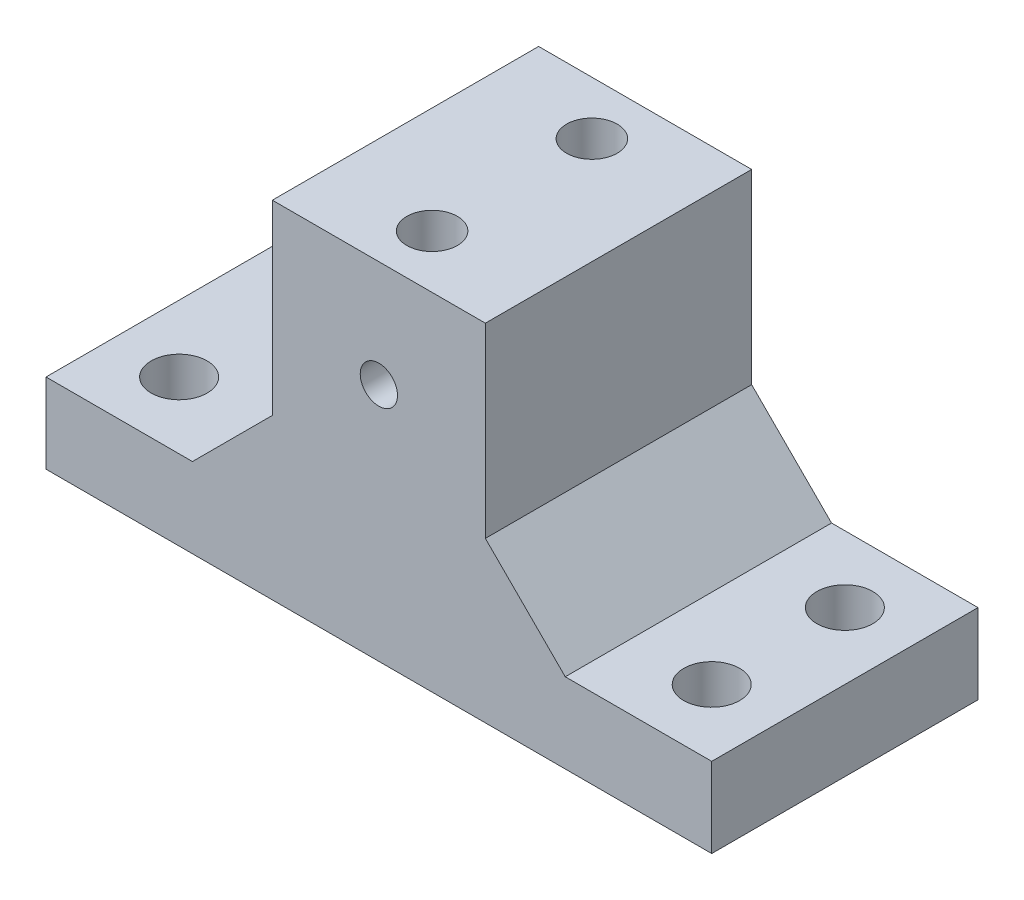
ISO-10303-21;
HEADER;
FILE_DESCRIPTION(('STEP AP214'),'2;1');
FILE_NAME('part.step','',(''),(''),'','','');
FILE_SCHEMA(('AUTOMOTIVE_DESIGN { 1 0 10303 214 1 1 1 1 }'));
ENDSEC;
DATA;
#1=APPLICATION_CONTEXT('core data for automotive mechanical design processes');
#2=APPLICATION_PROTOCOL_DEFINITION('international standard','automotive_design',2000,#1);
#3=PRODUCT_CONTEXT('',#1,'mechanical');
#4=PRODUCT('Part','Part','',(#3));
#5=PRODUCT_RELATED_PRODUCT_CATEGORY('part','',(#4));
#6=PRODUCT_DEFINITION_FORMATION('','',#4);
#7=PRODUCT_DEFINITION_CONTEXT('part definition',#1,'design');
#8=PRODUCT_DEFINITION('design','',#6,#7);
#9=PRODUCT_DEFINITION_SHAPE('','',#8);
#10=(LENGTH_UNIT() NAMED_UNIT(*) SI_UNIT(.MILLI.,.METRE.));
#11=(NAMED_UNIT(*) PLANE_ANGLE_UNIT() SI_UNIT($,.RADIAN.));
#12=(NAMED_UNIT(*) SI_UNIT($,.STERADIAN.) SOLID_ANGLE_UNIT());
#13=UNCERTAINTY_MEASURE_WITH_UNIT(LENGTH_MEASURE(1.E-05),#10,'distance_accuracy_value','');
#14=(GEOMETRIC_REPRESENTATION_CONTEXT(3) GLOBAL_UNCERTAINTY_ASSIGNED_CONTEXT((#13)) GLOBAL_UNIT_ASSIGNED_CONTEXT((#10,
#11,#12)) REPRESENTATION_CONTEXT('',''));
#15=CARTESIAN_POINT('',(0.,0.,0.));
#16=DIRECTION('',(0.,0.,1.));
#17=DIRECTION('',(1.,0.,0.));
#18=AXIS2_PLACEMENT_3D('',#15,#16,#17);
#19=CARTESIAN_POINT('',(0.,9.,5.));
#20=DIRECTION('',(0.,0.,-1.));
#21=DIRECTION('',(-1.,0.,0.));
#22=AXIS2_PLACEMENT_3D('',#19,#20,#21);
#23=CYLINDRICAL_SURFACE('',#22,0.7);
#24=DIRECTION('',(0.,0.,-1.));
#25=VECTOR('',#24,1.);
#26=CARTESIAN_POINT('',(0.489897948556637,9.5,5.));
#27=LINE('',#26,#25);
#28=CARTESIAN_POINT('',(0.489897948556637,9.5,-3.81394102980499));
#29=VERTEX_POINT('',#28);
#30=CARTESIAN_POINT('',(0.489897948556637,9.5,-2.18605897019501));
#31=VERTEX_POINT('',#30);
#32=EDGE_CURVE('E199',#29,#31,#27,.F.);
#33=ORIENTED_EDGE('',*,*,#32,.F.);
#34=CARTESIAN_POINT('',(0.489897948556637,9.5,-3.81394102980499));
#35=CARTESIAN_POINT('',(0.46383514749772,9.52553489441375,-3.82965873378239));
#36=CARTESIAN_POINT('',(0.435560438615705,9.54924078140096,-3.84493864043871));
#37=CARTESIAN_POINT('',(0.374693786295026,9.59246331686398,-3.8736328462048));
#38=CARTESIAN_POINT('',(0.342064379338082,9.61193924953212,-3.88702861029475));
#39=CARTESIAN_POINT('',(0.272891215641072,9.64576883293175,-3.91070042107566));
#40=CARTESIAN_POINT('',(0.236325940083225,9.66009225044292,-3.92095800310597));
#41=CARTESIAN_POINT('',(0.160551099313532,9.68247569432697,-3.93712937438413));
#42=CARTESIAN_POINT('',(0.121353973882514,9.69056320294,-3.94306221677441));
#43=CARTESIAN_POINT('',(0.0472017658295475,9.69926363205425,-3.94945413084439));
#44=CARTESIAN_POINT('',(0.0124029469641199,9.70075017613778,-3.95055277969539));
#45=CARTESIAN_POINT('',(-0.0569602676209119,9.69854058861984,-3.94892468635496));
#46=CARTESIAN_POINT('',(-0.0915245442872024,9.69484199780319,-3.94619612898891));
#47=CARTESIAN_POINT('',(-0.156481902878829,9.68301877347258,-3.93755016144121));
#48=CARTESIAN_POINT('',(-0.186985040274385,9.67528049798431,-3.93191153862283));
#49=CARTESIAN_POINT('',(-0.246154292093046,9.65603100544155,-3.91805881766305));
#50=CARTESIAN_POINT('',(-0.274819758511295,9.64451846614934,-3.90984381698307));
#51=CARTESIAN_POINT('',(-0.332371879774019,9.61695934425613,-3.89052434628036));
#52=CARTESIAN_POINT('',(-0.361038586429749,9.60059418960534,-3.87922421477719));
#53=CARTESIAN_POINT('',(-0.415286643776027,9.56444621151578,-3.85493815877419));
#54=CARTESIAN_POINT('',(-0.440870373962115,9.54466605289799,-3.84195355066695));
#55=CARTESIAN_POINT('',(-0.473395189222093,9.51577893143422,-3.8237076247308));
#56=CARTESIAN_POINT('',(-0.481752442813155,9.50798044248357,-3.81884460264679));
#57=CARTESIAN_POINT('',(-0.489897948556638,9.5,-3.81394102980498));
#58=B_SPLINE_CURVE_WITH_KNOTS('',3,(#34,#35,#36,#37,#38,#39,#40,#41,#42,#43,#44,#45,#46,#47,#48,
#49,#50,#51,#52,#53,#54,#55,#56,#57),.UNSPECIFIED.,.F.,.F.,(4,2,2,2,2,2,2,2,2,2,2,4),(0.,
0.119241378289111,0.239584116359932,0.360621890178003,0.481123140948002,0.58508363854771,
0.689093459404968,0.784604382531563,0.880148801817028,0.984439194715799,1.0886485717836,
1.12589897818031),.UNSPECIFIED.);
#59=CARTESIAN_POINT('',(-0.489897948556636,9.5,-3.81394102980498));
#60=VERTEX_POINT('',#59);
#61=EDGE_CURVE('E193',#29,#60,#58,.T.);
#62=ORIENTED_EDGE('',*,*,#61,.T.);
#63=DIRECTION('',(0.,0.,-1.));
#64=VECTOR('',#63,1.);
#65=CARTESIAN_POINT('',(-0.489897948556636,9.5,5.));
#66=LINE('',#65,#64);
#67=CARTESIAN_POINT('',(-0.489897948556636,9.5,-2.18605897019502));
#68=VERTEX_POINT('',#67);
#69=EDGE_CURVE('E309',#68,#60,#66,.T.);
#70=ORIENTED_EDGE('',*,*,#69,.F.);
#71=CARTESIAN_POINT('',(-0.489897948556636,9.5,-2.18605897019502));
#72=CARTESIAN_POINT('',(-0.46383514749772,9.52553489441375,-2.17034126621762));
#73=CARTESIAN_POINT('',(-0.435560438615704,9.54924078140096,-2.15506135956129));
#74=CARTESIAN_POINT('',(-0.374693786295025,9.59246331686398,-2.1263671537952));
#75=CARTESIAN_POINT('',(-0.342064379338082,9.61193924953212,-2.11297138970525));
#76=CARTESIAN_POINT('',(-0.272891215641072,9.64576883293175,-2.08929957892435));
#77=CARTESIAN_POINT('',(-0.236325940083225,9.66009225044292,-2.07904199689404));
#78=CARTESIAN_POINT('',(-0.160551099313532,9.68247569432697,-2.06287062561587));
#79=CARTESIAN_POINT('',(-0.121353973882514,9.69056320294,-2.0569377832256));
#80=CARTESIAN_POINT('',(-0.0472017658295468,9.69926363205425,-2.05054586915561));
#81=CARTESIAN_POINT('',(-0.0124029469641192,9.70075017613778,-2.04944722030462));
#82=CARTESIAN_POINT('',(0.0569602676209127,9.69854058861984,-2.05107531364504));
#83=CARTESIAN_POINT('',(0.0915245442872032,9.69484199780319,-2.05380387101109));
#84=CARTESIAN_POINT('',(0.156481902878831,9.68301877347258,-2.06244983855879));
#85=CARTESIAN_POINT('',(0.186985040274386,9.67528049798431,-2.06808846137717));
#86=CARTESIAN_POINT('',(0.246154292093047,9.65603100544155,-2.08194118233696));
#87=CARTESIAN_POINT('',(0.274819758511296,9.64451846614934,-2.09015618301693));
#88=CARTESIAN_POINT('',(0.33237187977402,9.61695934425613,-2.10947565371964));
#89=CARTESIAN_POINT('',(0.361038586429751,9.60059418960534,-2.12077578522281));
#90=CARTESIAN_POINT('',(0.415286643776029,9.56444621151578,-2.14506184122581));
#91=CARTESIAN_POINT('',(0.440870373962116,9.54466605289799,-2.15804644933305));
#92=CARTESIAN_POINT('',(0.473395189222093,9.51577893143422,-2.1762923752692));
#93=CARTESIAN_POINT('',(0.481752442813154,9.50798044248357,-2.18115539735321));
#94=CARTESIAN_POINT('',(0.489897948556637,9.5,-2.18605897019501));
#95=B_SPLINE_CURVE_WITH_KNOTS('',3,(#71,#72,#73,#74,#75,#76,#77,#78,#79,#80,#81,#82,#83,#84,#85,
#86,#87,#88,#89,#90,#91,#92,#93,#94),.UNSPECIFIED.,.F.,.F.,(4,2,2,2,2,2,2,2,2,2,2,4),(0.,
0.119241378289111,0.239584116359933,0.360621890178003,0.481123140948003,0.585083638547712,
0.689093459404969,0.784604382531565,0.880148801817029,0.9844391947158,1.0886485717836,
1.12589897818031),.UNSPECIFIED.);
#96=EDGE_CURVE('E187',#68,#31,#95,.T.);
#97=ORIENTED_EDGE('',*,*,#96,.T.);
#98=EDGE_LOOP('',(#33,#62,#70,#97));
#99=FACE_BOUND('',#98,.T.);
#100=CARTESIAN_POINT('',(0.,9.,5.));
#101=DIRECTION('',(0.,0.,-1.));
#102=DIRECTION('',(-1.,0.,0.));
#103=AXIS2_PLACEMENT_3D('',#100,#101,#102);
#104=CIRCLE('',#103,0.7);
#105=CARTESIAN_POINT('',(-0.7,9.,5.));
#106=VERTEX_POINT('',#105);
#107=EDGE_CURVE('E252',#106,#106,#104,.T.);
#108=ORIENTED_EDGE('',*,*,#107,.F.);
#109=EDGE_LOOP('',(#108));
#110=FACE_BOUND('',#109,.T.);
#111=CARTESIAN_POINT('',(0.,9.,-5.));
#112=DIRECTION('',(0.,0.,-1.));
#113=DIRECTION('',(-1.,0.,0.));
#114=AXIS2_PLACEMENT_3D('',#111,#112,#113);
#115=CIRCLE('',#114,0.7);
#116=CARTESIAN_POINT('',(-0.7,9.,-5.));
#117=VERTEX_POINT('',#116);
#118=EDGE_CURVE('E323',#117,#117,#115,.T.);
#119=ORIENTED_EDGE('',*,*,#118,.T.);
#120=EDGE_LOOP('',(#119));
#121=FACE_BOUND('',#120,.T.);
#122=DIRECTION('',(0.,0.,-1.));
#123=VECTOR('',#122,1.);
#124=CARTESIAN_POINT('',(0.489897948556637,9.5,5.));
#125=LINE('',#124,#123);
#126=CARTESIAN_POINT('',(0.489897948556637,9.5,2.18605897019501));
#127=VERTEX_POINT('',#126);
#128=CARTESIAN_POINT('',(0.489897948556637,9.5,3.81394102980499));
#129=VERTEX_POINT('',#128);
#130=EDGE_CURVE('E132',#127,#129,#125,.F.);
#131=ORIENTED_EDGE('',*,*,#130,.F.);
#132=CARTESIAN_POINT('',(0.489897948556637,9.5,2.18605897019501));
#133=CARTESIAN_POINT('',(0.46383514749772,9.52553489441375,2.17034126621761));
#134=CARTESIAN_POINT('',(0.435560438615704,9.54924078140096,2.15506135956129));
#135=CARTESIAN_POINT('',(0.374693786295025,9.59246331686398,2.1263671537952));
#136=CARTESIAN_POINT('',(0.342064379338082,9.61193924953212,2.11297138970525));
#137=CARTESIAN_POINT('',(0.272891215641072,9.64576883293175,2.08929957892435));
#138=CARTESIAN_POINT('',(0.236325940083225,9.66009225044292,2.07904199689403));
#139=CARTESIAN_POINT('',(0.160551099313532,9.68247569432697,2.06287062561587));
#140=CARTESIAN_POINT('',(0.121353973882514,9.69056320294,2.0569377832256));
#141=CARTESIAN_POINT('',(0.0472017658295473,9.69926363205425,2.05054586915561));
#142=CARTESIAN_POINT('',(0.0124029469641198,9.70075017613778,2.04944722030462));
#143=CARTESIAN_POINT('',(-0.0569602676209119,9.69854058861984,2.05107531364504));
#144=CARTESIAN_POINT('',(-0.0915245442872022,9.69484199780319,2.05380387101109));
#145=CARTESIAN_POINT('',(-0.156481902878829,9.68301877347258,2.06244983855879));
#146=CARTESIAN_POINT('',(-0.186985040274385,9.67528049798431,2.06808846137717));
#147=CARTESIAN_POINT('',(-0.246154292093046,9.65603100544155,2.08194118233696));
#148=CARTESIAN_POINT('',(-0.274819758511295,9.64451846614934,2.09015618301693));
#149=CARTESIAN_POINT('',(-0.332371879774019,9.61695934425613,2.10947565371964));
#150=CARTESIAN_POINT('',(-0.361038586429749,9.60059418960534,2.12077578522282));
#151=CARTESIAN_POINT('',(-0.415286643776027,9.56444621151579,2.14506184122581));
#152=CARTESIAN_POINT('',(-0.440870373962115,9.54466605289799,2.15804644933305));
#153=CARTESIAN_POINT('',(-0.473395189222092,9.51577893143422,2.1762923752692));
#154=CARTESIAN_POINT('',(-0.481752442813154,9.50798044248357,2.18115539735322));
#155=CARTESIAN_POINT('',(-0.489897948556638,9.5,2.18605897019502));
#156=B_SPLINE_CURVE_WITH_KNOTS('',3,(#132,#133,#134,#135,#136,#137,#138,#139,#140,#141,#142,
#143,#144,#145,#146,#147,#148,#149,#150,#151,#152,#153,#154,#155),.UNSPECIFIED.,.F.,.F.,(4,2,2,
2,2,2,2,2,2,2,2,4),(0.,0.119241378289111,0.239584116359932,0.360621890178002,0.481123140948002,
0.58508363854771,0.689093459404967,0.784604382531563,0.880148801817027,0.984439194715797,
1.0886485717836,1.12589897818031),.UNSPECIFIED.);
#157=CARTESIAN_POINT('',(-0.489897948556636,9.5,2.18605897019502));
#158=VERTEX_POINT('',#157);
#159=EDGE_CURVE('E148',#127,#158,#156,.T.);
#160=ORIENTED_EDGE('',*,*,#159,.T.);
#161=DIRECTION('',(0.,0.,-1.));
#162=VECTOR('',#161,1.);
#163=CARTESIAN_POINT('',(-0.489897948556636,9.5,5.));
#164=LINE('',#163,#162);
#165=CARTESIAN_POINT('',(-0.489897948556636,9.5,3.81394102980498));
#166=VERTEX_POINT('',#165);
#167=EDGE_CURVE('E140',#166,#158,#164,.T.);
#168=ORIENTED_EDGE('',*,*,#167,.F.);
#169=CARTESIAN_POINT('',(-0.489897948556636,9.5,3.81394102980498));
#170=CARTESIAN_POINT('',(-0.46383514749772,9.52553489441375,3.82965873378238));
#171=CARTESIAN_POINT('',(-0.435560438615704,9.54924078140096,3.84493864043871));
#172=CARTESIAN_POINT('',(-0.374693786295025,9.59246331686398,3.8736328462048));
#173=CARTESIAN_POINT('',(-0.342064379338082,9.61193924953212,3.88702861029475));
#174=CARTESIAN_POINT('',(-0.272891215641072,9.64576883293175,3.91070042107565));
#175=CARTESIAN_POINT('',(-0.236325940083225,9.66009225044292,3.92095800310597));
#176=CARTESIAN_POINT('',(-0.160551099313532,9.68247569432697,3.93712937438413));
#177=CARTESIAN_POINT('',(-0.121353973882513,9.69056320294,3.94306221677441));
#178=CARTESIAN_POINT('',(-0.0472017658295459,9.69926363205425,3.94945413084439));
#179=CARTESIAN_POINT('',(-0.0124029469641183,9.70075017613778,3.95055277969539));
#180=CARTESIAN_POINT('',(0.0569602676209136,9.69854058861984,3.94892468635496));
#181=CARTESIAN_POINT('',(0.0915245442872043,9.69484199780319,3.94619612898891));
#182=CARTESIAN_POINT('',(0.156481902878831,9.68301877347258,3.93755016144121));
#183=CARTESIAN_POINT('',(0.186985040274387,9.67528049798431,3.93191153862283));
#184=CARTESIAN_POINT('',(0.246154292093047,9.65603100544155,3.91805881766305));
#185=CARTESIAN_POINT('',(0.274819758511297,9.64451846614934,3.90984381698307));
#186=CARTESIAN_POINT('',(0.332371879774021,9.61695934425613,3.89052434628037));
#187=CARTESIAN_POINT('',(0.361038586429751,9.60059418960534,3.87922421477719));
#188=CARTESIAN_POINT('',(0.415286643776029,9.56444621151578,3.8549381587742));
#189=CARTESIAN_POINT('',(0.440870373962117,9.54466605289799,3.84195355066696));
#190=CARTESIAN_POINT('',(0.473395189222093,9.51577893143422,3.82370762473081));
#191=CARTESIAN_POINT('',(0.481752442813155,9.50798044248357,3.81884460264679));
#192=CARTESIAN_POINT('',(0.489897948556637,9.5,3.81394102980499));
#193=B_SPLINE_CURVE_WITH_KNOTS('',3,(#169,#170,#171,#172,#173,#174,#175,#176,#177,#178,#179,
#180,#181,#182,#183,#184,#185,#186,#187,#188,#189,#190,#191,#192),.UNSPECIFIED.,.F.,.F.,(4,2,2,
2,2,2,2,2,2,2,2,4),(0.,0.119241378289111,0.239584116359933,0.360621890178003,0.481123140948004,
0.585083638547713,0.689093459404971,0.784604382531567,0.88014880181703,0.9844391947158,
1.0886485717836,1.12589897818031),.UNSPECIFIED.);
#194=EDGE_CURVE('E146',#166,#129,#193,.T.);
#195=ORIENTED_EDGE('',*,*,#194,.T.);
#196=EDGE_LOOP('',(#131,#160,#168,#195));
#197=FACE_BOUND('',#196,.T.);
#198=ADVANCED_FACE('F32',(#99,#110,#121,#197),#23,.F.);
#199=CARTESIAN_POINT('',(0.,3.,0.));
#200=DIRECTION('',(0.,-1.,0.));
#201=DIRECTION('',(0.,0.,-1.));
#202=AXIS2_PLACEMENT_3D('',#199,#200,#201);
#203=PLANE('',#202);
#204=CARTESIAN_POINT('',(10.,3.,2.5));
#205=DIRECTION('',(0.,1.,0.));
#206=DIRECTION('',(0.,0.,1.));
#207=AXIS2_PLACEMENT_3D('',#204,#205,#206);
#208=CIRCLE('',#207,1.05);
#209=CARTESIAN_POINT('',(10.,3.,3.55));
#210=VERTEX_POINT('',#209);
#211=EDGE_CURVE('E259',#210,#210,#208,.T.);
#212=ORIENTED_EDGE('',*,*,#211,.F.);
#213=EDGE_LOOP('',(#212));
#214=FACE_BOUND('',#213,.T.);
#215=CARTESIAN_POINT('',(10.,3.,-2.5));
#216=DIRECTION('',(0.,1.,0.));
#217=DIRECTION('',(0.,0.,1.));
#218=AXIS2_PLACEMENT_3D('',#215,#216,#217);
#219=CIRCLE('',#218,1.05);
#220=CARTESIAN_POINT('',(10.,3.,-1.45));
#221=VERTEX_POINT('',#220);
#222=EDGE_CURVE('E267',#221,#221,#219,.T.);
#223=ORIENTED_EDGE('',*,*,#222,.F.);
#224=EDGE_LOOP('',(#223));
#225=FACE_BOUND('',#224,.T.);
#226=DIRECTION('',(-1.,0.,0.));
#227=VECTOR('',#226,1.);
#228=CARTESIAN_POINT('',(-12.5,3.,-5.));
#229=LINE('',#228,#227);
#230=CARTESIAN_POINT('',(12.5,3.,-5.));
#231=VERTEX_POINT('',#230);
#232=CARTESIAN_POINT('',(7.00000000000002,3.,-5.));
#233=VERTEX_POINT('',#232);
#234=EDGE_CURVE('E289',#231,#233,#229,.T.);
#235=ORIENTED_EDGE('',*,*,#234,.T.);
#236=DIRECTION('',(0.,0.,1.));
#237=VECTOR('',#236,1.);
#238=CARTESIAN_POINT('',(7.00000000000002,3.,0.));
#239=LINE('',#238,#237);
#240=CARTESIAN_POINT('',(7.00000000000002,3.,5.));
#241=VERTEX_POINT('',#240);
#242=EDGE_CURVE('E206',#233,#241,#239,.T.);
#243=ORIENTED_EDGE('',*,*,#242,.T.);
#244=DIRECTION('',(1.,0.,0.));
#245=VECTOR('',#244,1.);
#246=CARTESIAN_POINT('',(-12.5,3.,5.));
#247=LINE('',#246,#245);
#248=CARTESIAN_POINT('',(12.5,3.,5.));
#249=VERTEX_POINT('',#248);
#250=EDGE_CURVE('E233',#241,#249,#247,.T.);
#251=ORIENTED_EDGE('',*,*,#250,.T.);
#252=DIRECTION('',(0.,0.,-1.));
#253=VECTOR('',#252,1.);
#254=CARTESIAN_POINT('',(12.5,3.,5.));
#255=LINE('',#254,#253);
#256=EDGE_CURVE('E285',#249,#231,#255,.T.);
#257=ORIENTED_EDGE('',*,*,#256,.T.);
#258=EDGE_LOOP('',(#235,#243,#251,#257));
#259=FACE_BOUND('',#258,.T.);
#260=ADVANCED_FACE('F341',(#214,#225,#259),#203,.F.);
#261=CARTESIAN_POINT('',(-12.5,3.,5.));
#262=VERTEX_POINT('',#261);
#263=CARTESIAN_POINT('',(-7.00000000000002,3.,5.));
#264=VERTEX_POINT('',#263);
#265=EDGE_CURVE('E219',#262,#264,#247,.T.);
#266=ORIENTED_EDGE('',*,*,#265,.T.);
#267=DIRECTION('',(0.,0.,-1.));
#268=VECTOR('',#267,1.);
#269=CARTESIAN_POINT('',(-7.00000000000002,3.,0.));
#270=LINE('',#269,#268);
#271=CARTESIAN_POINT('',(-7.00000000000002,3.,-5.));
#272=VERTEX_POINT('',#271);
#273=EDGE_CURVE('E139',#264,#272,#270,.T.);
#274=ORIENTED_EDGE('',*,*,#273,.T.);
#275=CARTESIAN_POINT('',(-12.5,3.,-5.));
#276=VERTEX_POINT('',#275);
#277=EDGE_CURVE('E242',#272,#276,#229,.T.);
#278=ORIENTED_EDGE('',*,*,#277,.T.);
#279=DIRECTION('',(0.,0.,1.));
#280=VECTOR('',#279,1.);
#281=CARTESIAN_POINT('',(-12.5,3.,5.));
#282=LINE('',#281,#280);
#283=EDGE_CURVE('E230',#276,#262,#282,.T.);
#284=ORIENTED_EDGE('',*,*,#283,.T.);
#285=EDGE_LOOP('',(#266,#274,#278,#284));
#286=FACE_BOUND('',#285,.T.);
#287=CARTESIAN_POINT('',(-10.,3.,-2.5));
#288=DIRECTION('',(0.,1.,0.));
#289=DIRECTION('',(0.,0.,1.));
#290=AXIS2_PLACEMENT_3D('',#287,#288,#289);
#291=CIRCLE('',#290,1.05);
#292=CARTESIAN_POINT('',(-10.,3.,-1.45));
#293=VERTEX_POINT('',#292);
#294=EDGE_CURVE('E279',#293,#293,#291,.T.);
#295=ORIENTED_EDGE('',*,*,#294,.F.);
#296=EDGE_LOOP('',(#295));
#297=FACE_BOUND('',#296,.T.);
#298=CARTESIAN_POINT('',(-10.,3.,2.5));
#299=DIRECTION('',(0.,1.,0.));
#300=DIRECTION('',(0.,0.,1.));
#301=AXIS2_PLACEMENT_3D('',#298,#299,#300);
#302=CIRCLE('',#301,1.05);
#303=CARTESIAN_POINT('',(-10.,3.,3.55));
#304=VERTEX_POINT('',#303);
#305=EDGE_CURVE('E273',#304,#304,#302,.T.);
#306=ORIENTED_EDGE('',*,*,#305,.F.);
#307=EDGE_LOOP('',(#306));
#308=FACE_BOUND('',#307,.T.);
#309=ADVANCED_FACE('F226',(#286,#297,#308),#203,.F.);
#310=CARTESIAN_POINT('',(0.,0.,0.));
#311=DIRECTION('',(0.,-1.,0.));
#312=DIRECTION('',(0.,0.,-1.));
#313=AXIS2_PLACEMENT_3D('',#310,#311,#312);
#314=PLANE('',#313);
#315=DIRECTION('',(0.,0.,1.));
#316=VECTOR('',#315,1.);
#317=CARTESIAN_POINT('',(-12.5,0.,5.));
#318=LINE('',#317,#316);
#319=CARTESIAN_POINT('',(-12.5,0.,-5.));
#320=VERTEX_POINT('',#319);
#321=CARTESIAN_POINT('',(-12.5,0.,5.));
#322=VERTEX_POINT('',#321);
#323=EDGE_CURVE('E297',#320,#322,#318,.T.);
#324=ORIENTED_EDGE('',*,*,#323,.F.);
#325=DIRECTION('',(-1.,0.,0.));
#326=VECTOR('',#325,1.);
#327=CARTESIAN_POINT('',(-12.5,0.,-5.));
#328=LINE('',#327,#326);
#329=CARTESIAN_POINT('',(12.5,0.,-5.));
#330=VERTEX_POINT('',#329);
#331=EDGE_CURVE('E295',#330,#320,#328,.T.);
#332=ORIENTED_EDGE('',*,*,#331,.F.);
#333=DIRECTION('',(0.,0.,-1.));
#334=VECTOR('',#333,1.);
#335=CARTESIAN_POINT('',(12.5,0.,5.));
#336=LINE('',#335,#334);
#337=CARTESIAN_POINT('',(12.5,0.,5.));
#338=VERTEX_POINT('',#337);
#339=EDGE_CURVE('E282',#338,#330,#336,.T.);
#340=ORIENTED_EDGE('',*,*,#339,.F.);
#341=DIRECTION('',(1.,0.,0.));
#342=VECTOR('',#341,1.);
#343=CARTESIAN_POINT('',(-12.5,0.,5.));
#344=LINE('',#343,#342);
#345=EDGE_CURVE('E288',#322,#338,#344,.T.);
#346=ORIENTED_EDGE('',*,*,#345,.F.);
#347=EDGE_LOOP('',(#324,#332,#340,#346));
#348=FACE_BOUND('',#347,.T.);
#349=CARTESIAN_POINT('',(-10.,0.,-2.5));
#350=DIRECTION('',(0.,1.,0.));
#351=DIRECTION('',(0.,0.,1.));
#352=AXIS2_PLACEMENT_3D('',#349,#350,#351);
#353=CIRCLE('',#352,1.05);
#354=CARTESIAN_POINT('',(-10.,0.,-1.45));
#355=VERTEX_POINT('',#354);
#356=EDGE_CURVE('E276',#355,#355,#353,.T.);
#357=ORIENTED_EDGE('',*,*,#356,.T.);
#358=EDGE_LOOP('',(#357));
#359=FACE_BOUND('',#358,.T.);
#360=CARTESIAN_POINT('',(-10.,0.,2.5));
#361=DIRECTION('',(0.,1.,0.));
#362=DIRECTION('',(0.,0.,1.));
#363=AXIS2_PLACEMENT_3D('',#360,#361,#362);
#364=CIRCLE('',#363,1.05);
#365=CARTESIAN_POINT('',(-10.,0.,3.55));
#366=VERTEX_POINT('',#365);
#367=EDGE_CURVE('E270',#366,#366,#364,.T.);
#368=ORIENTED_EDGE('',*,*,#367,.T.);
#369=EDGE_LOOP('',(#368));
#370=FACE_BOUND('',#369,.T.);
#371=CARTESIAN_POINT('',(10.,0.,2.5));
#372=DIRECTION('',(0.,1.,0.));
#373=DIRECTION('',(0.,0.,1.));
#374=AXIS2_PLACEMENT_3D('',#371,#372,#373);
#375=CIRCLE('',#374,1.05);
#376=CARTESIAN_POINT('',(10.,0.,3.55));
#377=VERTEX_POINT('',#376);
#378=EDGE_CURVE('E263',#377,#377,#375,.T.);
#379=ORIENTED_EDGE('',*,*,#378,.T.);
#380=EDGE_LOOP('',(#379));
#381=FACE_BOUND('',#380,.T.);
#382=CARTESIAN_POINT('',(10.,0.,-2.5));
#383=DIRECTION('',(0.,1.,0.));
#384=DIRECTION('',(0.,0.,1.));
#385=AXIS2_PLACEMENT_3D('',#382,#383,#384);
#386=CIRCLE('',#385,1.05);
#387=CARTESIAN_POINT('',(10.,0.,-1.45));
#388=VERTEX_POINT('',#387);
#389=EDGE_CURVE('E262',#388,#388,#386,.T.);
#390=ORIENTED_EDGE('',*,*,#389,.T.);
#391=EDGE_LOOP('',(#390));
#392=FACE_BOUND('',#391,.T.);
#393=ADVANCED_FACE('F353',(#348,#359,#370,#381,#392),#314,.T.);
#394=CARTESIAN_POINT('',(12.5,3.,5.));
#395=DIRECTION('',(-1.,0.,0.));
#396=DIRECTION('',(0.,0.,1.));
#397=AXIS2_PLACEMENT_3D('',#394,#395,#396);
#398=PLANE('',#397);
#399=ORIENTED_EDGE('',*,*,#339,.T.);
#400=DIRECTION('',(0.,-1.,0.));
#401=VECTOR('',#400,1.);
#402=CARTESIAN_POINT('',(12.5,3.,-5.));
#403=LINE('',#402,#401);
#404=EDGE_CURVE('E307',#231,#330,#403,.T.);
#405=ORIENTED_EDGE('',*,*,#404,.F.);
#406=ORIENTED_EDGE('',*,*,#256,.F.);
#407=DIRECTION('',(0.,-1.,0.));
#408=VECTOR('',#407,1.);
#409=CARTESIAN_POINT('',(12.5,3.,5.));
#410=LINE('',#409,#408);
#411=EDGE_CURVE('E232',#249,#338,#410,.T.);
#412=ORIENTED_EDGE('',*,*,#411,.T.);
#413=EDGE_LOOP('',(#399,#405,#406,#412));
#414=FACE_BOUND('',#413,.T.);
#415=ADVANCED_FACE('F348',(#414),#398,.F.);
#416=CARTESIAN_POINT('',(-12.5,3.,-5.));
#417=DIRECTION('',(0.,0.,1.));
#418=DIRECTION('',(1.,0.,0.));
#419=AXIS2_PLACEMENT_3D('',#416,#417,#418);
#420=PLANE('',#419);
#421=ORIENTED_EDGE('',*,*,#118,.F.);
#422=EDGE_LOOP('',(#421));
#423=FACE_BOUND('',#422,.T.);
#424=ORIENTED_EDGE('',*,*,#277,.F.);
#425=DIRECTION('',(0.707106781186552,0.707106781186543,0.));
#426=VECTOR('',#425,1.);
#427=CARTESIAN_POINT('',(-9.75000000000004,0.250000000000008,-5.));
#428=LINE('',#427,#426);
#429=CARTESIAN_POINT('',(-4.,5.99999999999998,-5.));
#430=VERTEX_POINT('',#429);
#431=EDGE_CURVE('E210',#272,#430,#428,.T.);
#432=ORIENTED_EDGE('',*,*,#431,.T.);
#433=DIRECTION('',(0.,1.,0.));
#434=VECTOR('',#433,1.);
#435=CARTESIAN_POINT('',(-4.,0.,-5.));
#436=LINE('',#435,#434);
#437=CARTESIAN_POINT('',(-4.,13.,-5.));
#438=VERTEX_POINT('',#437);
#439=EDGE_CURVE('E239',#430,#438,#436,.T.);
#440=ORIENTED_EDGE('',*,*,#439,.T.);
#441=DIRECTION('',(1.,0.,0.));
#442=VECTOR('',#441,1.);
#443=CARTESIAN_POINT('',(4.,13.,-5.));
#444=LINE('',#443,#442);
#445=CARTESIAN_POINT('',(4.,13.,-5.));
#446=VERTEX_POINT('',#445);
#447=EDGE_CURVE('E248',#438,#446,#444,.T.);
#448=ORIENTED_EDGE('',*,*,#447,.T.);
#449=DIRECTION('',(0.,-1.,0.));
#450=VECTOR('',#449,1.);
#451=CARTESIAN_POINT('',(4.,0.,-5.));
#452=LINE('',#451,#450);
#453=CARTESIAN_POINT('',(4.,5.99999999999999,-5.));
#454=VERTEX_POINT('',#453);
#455=EDGE_CURVE('E249',#446,#454,#452,.T.);
#456=ORIENTED_EDGE('',*,*,#455,.T.);
#457=DIRECTION('',(0.707106781186552,-0.707106781186543,0.));
#458=VECTOR('',#457,1.);
#459=CARTESIAN_POINT('',(-2.75000000000011,12.75,-5.));
#460=LINE('',#459,#458);
#461=EDGE_CURVE('E11',#454,#233,#460,.T.);
#462=ORIENTED_EDGE('',*,*,#461,.T.);
#463=ORIENTED_EDGE('',*,*,#234,.F.);
#464=ORIENTED_EDGE('',*,*,#404,.T.);
#465=ORIENTED_EDGE('',*,*,#331,.T.);
#466=DIRECTION('',(0.,-1.,0.));
#467=VECTOR('',#466,1.);
#468=CARTESIAN_POINT('',(-12.5,3.,-5.));
#469=LINE('',#468,#467);
#470=EDGE_CURVE('E304',#276,#320,#469,.T.);
#471=ORIENTED_EDGE('',*,*,#470,.F.);
#472=EDGE_LOOP('',(#424,#432,#440,#448,#456,#462,#463,#464,#465,#471));
#473=FACE_BOUND('',#472,.T.);
#474=ADVANCED_FACE('F237',(#423,#473),#420,.F.);
#475=CARTESIAN_POINT('',(-12.5,3.,5.));
#476=DIRECTION('',(1.,0.,0.));
#477=DIRECTION('',(0.,0.,-1.));
#478=AXIS2_PLACEMENT_3D('',#475,#476,#477);
#479=PLANE('',#478);
#480=ORIENTED_EDGE('',*,*,#323,.T.);
#481=DIRECTION('',(0.,-1.,0.));
#482=VECTOR('',#481,1.);
#483=CARTESIAN_POINT('',(-12.5,3.,5.));
#484=LINE('',#483,#482);
#485=EDGE_CURVE('E302',#262,#322,#484,.T.);
#486=ORIENTED_EDGE('',*,*,#485,.F.);
#487=ORIENTED_EDGE('',*,*,#283,.F.);
#488=ORIENTED_EDGE('',*,*,#470,.T.);
#489=EDGE_LOOP('',(#480,#486,#487,#488));
#490=FACE_BOUND('',#489,.T.);
#491=ADVANCED_FACE('F352',(#490),#479,.F.);
#492=CARTESIAN_POINT('',(-12.5,3.,5.));
#493=DIRECTION('',(0.,0.,-1.));
#494=DIRECTION('',(-1.,0.,0.));
#495=AXIS2_PLACEMENT_3D('',#492,#493,#494);
#496=PLANE('',#495);
#497=ORIENTED_EDGE('',*,*,#107,.T.);
#498=EDGE_LOOP('',(#497));
#499=FACE_BOUND('',#498,.T.);
#500=ORIENTED_EDGE('',*,*,#345,.T.);
#501=ORIENTED_EDGE('',*,*,#411,.F.);
#502=ORIENTED_EDGE('',*,*,#250,.F.);
#503=DIRECTION('',(-0.707106781186552,0.707106781186543,0.));
#504=VECTOR('',#503,1.);
#505=CARTESIAN_POINT('',(-2.75000000000011,12.75,5.));
#506=LINE('',#505,#504);
#507=CARTESIAN_POINT('',(4.,5.99999999999999,5.));
#508=VERTEX_POINT('',#507);
#509=EDGE_CURVE('E40',#241,#508,#506,.T.);
#510=ORIENTED_EDGE('',*,*,#509,.T.);
#511=DIRECTION('',(0.,1.,0.));
#512=VECTOR('',#511,1.);
#513=CARTESIAN_POINT('',(4.,0.,5.));
#514=LINE('',#513,#512);
#515=CARTESIAN_POINT('',(4.,13.,5.));
#516=VERTEX_POINT('',#515);
#517=EDGE_CURVE('E266',#508,#516,#514,.T.);
#518=ORIENTED_EDGE('',*,*,#517,.T.);
#519=DIRECTION('',(-1.,0.,0.));
#520=VECTOR('',#519,1.);
#521=CARTESIAN_POINT('',(4.,13.,5.));
#522=LINE('',#521,#520);
#523=CARTESIAN_POINT('',(-4.,13.,5.));
#524=VERTEX_POINT('',#523);
#525=EDGE_CURVE('E332',#516,#524,#522,.T.);
#526=ORIENTED_EDGE('',*,*,#525,.T.);
#527=DIRECTION('',(0.,-1.,0.));
#528=VECTOR('',#527,1.);
#529=CARTESIAN_POINT('',(-4.,0.,5.));
#530=LINE('',#529,#528);
#531=CARTESIAN_POINT('',(-4.,5.99999999999998,5.));
#532=VERTEX_POINT('',#531);
#533=EDGE_CURVE('E221',#524,#532,#530,.T.);
#534=ORIENTED_EDGE('',*,*,#533,.T.);
#535=DIRECTION('',(-0.707106781186552,-0.707106781186543,0.));
#536=VECTOR('',#535,1.);
#537=CARTESIAN_POINT('',(-9.75000000000004,0.250000000000008,5.));
#538=LINE('',#537,#536);
#539=EDGE_CURVE('E212',#532,#264,#538,.T.);
#540=ORIENTED_EDGE('',*,*,#539,.T.);
#541=ORIENTED_EDGE('',*,*,#265,.F.);
#542=ORIENTED_EDGE('',*,*,#485,.T.);
#543=EDGE_LOOP('',(#500,#501,#502,#510,#518,#526,#534,#540,#541,#542));
#544=FACE_BOUND('',#543,.T.);
#545=ADVANCED_FACE('F217',(#499,#544),#496,.F.);
#546=CARTESIAN_POINT('',(-10.,3.,-2.5));
#547=DIRECTION('',(0.,-1.,0.));
#548=DIRECTION('',(0.,0.,-1.));
#549=AXIS2_PLACEMENT_3D('',#546,#547,#548);
#550=CYLINDRICAL_SURFACE('',#549,1.05);
#551=ORIENTED_EDGE('',*,*,#294,.T.);
#552=EDGE_LOOP('',(#551));
#553=FACE_BOUND('',#552,.T.);
#554=ORIENTED_EDGE('',*,*,#356,.F.);
#555=EDGE_LOOP('',(#554));
#556=FACE_BOUND('',#555,.T.);
#557=ADVANCED_FACE('F377',(#553,#556),#550,.F.);
#558=CARTESIAN_POINT('',(-10.,3.,2.5));
#559=DIRECTION('',(0.,-1.,0.));
#560=DIRECTION('',(0.,0.,-1.));
#561=AXIS2_PLACEMENT_3D('',#558,#559,#560);
#562=CYLINDRICAL_SURFACE('',#561,1.05);
#563=ORIENTED_EDGE('',*,*,#305,.T.);
#564=EDGE_LOOP('',(#563));
#565=FACE_BOUND('',#564,.T.);
#566=ORIENTED_EDGE('',*,*,#367,.F.);
#567=EDGE_LOOP('',(#566));
#568=FACE_BOUND('',#567,.T.);
#569=ADVANCED_FACE('F368',(#565,#568),#562,.F.);
#570=CARTESIAN_POINT('',(10.,3.,-2.5));
#571=DIRECTION('',(0.,-1.,0.));
#572=DIRECTION('',(0.,0.,-1.));
#573=AXIS2_PLACEMENT_3D('',#570,#571,#572);
#574=CYLINDRICAL_SURFACE('',#573,1.05);
#575=ORIENTED_EDGE('',*,*,#222,.T.);
#576=EDGE_LOOP('',(#575));
#577=FACE_BOUND('',#576,.T.);
#578=ORIENTED_EDGE('',*,*,#389,.F.);
#579=EDGE_LOOP('',(#578));
#580=FACE_BOUND('',#579,.T.);
#581=ADVANCED_FACE('F365',(#577,#580),#574,.F.);
#582=CARTESIAN_POINT('',(10.,3.,2.5));
#583=DIRECTION('',(0.,-1.,0.));
#584=DIRECTION('',(0.,0.,-1.));
#585=AXIS2_PLACEMENT_3D('',#582,#583,#584);
#586=CYLINDRICAL_SURFACE('',#585,1.05);
#587=ORIENTED_EDGE('',*,*,#211,.T.);
#588=EDGE_LOOP('',(#587));
#589=FACE_BOUND('',#588,.T.);
#590=ORIENTED_EDGE('',*,*,#378,.F.);
#591=EDGE_LOOP('',(#590));
#592=FACE_BOUND('',#591,.T.);
#593=ADVANCED_FACE('F367',(#589,#592),#586,.F.);
#594=CARTESIAN_POINT('',(4.,0.,20.2643375224737));
#595=DIRECTION('',(1.,0.,0.));
#596=DIRECTION('',(0.,0.,-1.));
#597=AXIS2_PLACEMENT_3D('',#594,#595,#596);
#598=PLANE('',#597);
#599=ORIENTED_EDGE('',*,*,#517,.F.);
#600=DIRECTION('',(0.,0.,-1.));
#601=VECTOR('',#600,1.);
#602=CARTESIAN_POINT('',(4.,5.99999999999999,20.2643375224737));
#603=LINE('',#602,#601);
#604=EDGE_CURVE('E53',#508,#454,#603,.T.);
#605=ORIENTED_EDGE('',*,*,#604,.T.);
#606=ORIENTED_EDGE('',*,*,#455,.F.);
#607=DIRECTION('',(0.,0.,-1.));
#608=VECTOR('',#607,1.);
#609=CARTESIAN_POINT('',(4.,13.,20.2643375224737));
#610=LINE('',#609,#608);
#611=EDGE_CURVE('E256',#516,#446,#610,.T.);
#612=ORIENTED_EDGE('',*,*,#611,.F.);
#613=EDGE_LOOP('',(#599,#605,#606,#612));
#614=FACE_BOUND('',#613,.T.);
#615=ADVANCED_FACE('F336',(#614),#598,.T.);
#616=CARTESIAN_POINT('',(-4.,0.,20.2643375224737));
#617=DIRECTION('',(-1.,0.,0.));
#618=DIRECTION('',(0.,0.,1.));
#619=AXIS2_PLACEMENT_3D('',#616,#617,#618);
#620=PLANE('',#619);
#621=ORIENTED_EDGE('',*,*,#439,.F.);
#622=DIRECTION('',(0.,0.,1.));
#623=VECTOR('',#622,1.);
#624=CARTESIAN_POINT('',(-4.,5.99999999999998,20.2643375224737));
#625=LINE('',#624,#623);
#626=EDGE_CURVE('E204',#430,#532,#625,.T.);
#627=ORIENTED_EDGE('',*,*,#626,.T.);
#628=ORIENTED_EDGE('',*,*,#533,.F.);
#629=DIRECTION('',(0.,0.,-1.));
#630=VECTOR('',#629,1.);
#631=CARTESIAN_POINT('',(-4.,13.,20.2643375224737));
#632=LINE('',#631,#630);
#633=EDGE_CURVE('E246',#524,#438,#632,.T.);
#634=ORIENTED_EDGE('',*,*,#633,.T.);
#635=EDGE_LOOP('',(#621,#627,#628,#634));
#636=FACE_BOUND('',#635,.T.);
#637=ADVANCED_FACE('F244',(#636),#620,.T.);
#638=CARTESIAN_POINT('',(4.,13.,20.2643375224737));
#639=DIRECTION('',(0.,1.,0.));
#640=DIRECTION('',(-1.,0.,0.));
#641=AXIS2_PLACEMENT_3D('',#638,#639,#640);
#642=PLANE('',#641);
#643=CARTESIAN_POINT('',(0.,13.,3.));
#644=DIRECTION('',(0.,1.,0.));
#645=DIRECTION('',(-1.,0.,0.));
#646=AXIS2_PLACEMENT_3D('',#643,#644,#645);
#647=CIRCLE('',#646,0.95);
#648=CARTESIAN_POINT('',(-0.949999999999993,13.,3.));
#649=VERTEX_POINT('',#648);
#650=EDGE_CURVE('E160',#649,#649,#647,.T.);
#651=ORIENTED_EDGE('',*,*,#650,.F.);
#652=EDGE_LOOP('',(#651));
#653=FACE_BOUND('',#652,.T.);
#654=CARTESIAN_POINT('',(0.,13.,-3.));
#655=DIRECTION('',(0.,1.,0.));
#656=DIRECTION('',(-1.,0.,0.));
#657=AXIS2_PLACEMENT_3D('',#654,#655,#656);
#658=CIRCLE('',#657,0.95);
#659=CARTESIAN_POINT('',(-0.949999999999994,13.,-3.));
#660=VERTEX_POINT('',#659);
#661=EDGE_CURVE('E152',#660,#660,#658,.T.);
#662=ORIENTED_EDGE('',*,*,#661,.F.);
#663=EDGE_LOOP('',(#662));
#664=FACE_BOUND('',#663,.T.);
#665=ORIENTED_EDGE('',*,*,#525,.F.);
#666=ORIENTED_EDGE('',*,*,#611,.T.);
#667=ORIENTED_EDGE('',*,*,#447,.F.);
#668=ORIENTED_EDGE('',*,*,#633,.F.);
#669=EDGE_LOOP('',(#665,#666,#667,#668));
#670=FACE_BOUND('',#669,.T.);
#671=ADVANCED_FACE('F183',(#653,#664,#670),#642,.T.);
#672=CARTESIAN_POINT('',(0.,9.5,-3.));
#673=DIRECTION('',(0.,1.,0.));
#674=DIRECTION('',(-1.,0.,0.));
#675=AXIS2_PLACEMENT_3D('',#672,#673,#674);
#676=CYLINDRICAL_SURFACE('',#675,0.95);
#677=ORIENTED_EDGE('',*,*,#661,.T.);
#678=EDGE_LOOP('',(#677));
#679=FACE_BOUND('',#678,.T.);
#680=CARTESIAN_POINT('',(0.,9.5,-3.));
#681=DIRECTION('',(0.,1.,0.));
#682=DIRECTION('',(-1.,0.,0.));
#683=AXIS2_PLACEMENT_3D('',#680,#681,#682);
#684=CIRCLE('',#683,0.95);
#685=EDGE_CURVE('E322',#31,#29,#684,.T.);
#686=ORIENTED_EDGE('',*,*,#685,.F.);
#687=ORIENTED_EDGE('',*,*,#96,.F.);
#688=EDGE_CURVE('E320',#60,#68,#684,.T.);
#689=ORIENTED_EDGE('',*,*,#688,.F.);
#690=ORIENTED_EDGE('',*,*,#61,.F.);
#691=EDGE_LOOP('',(#686,#687,#689,#690));
#692=FACE_BOUND('',#691,.T.);
#693=ADVANCED_FACE('F179',(#679,#692),#676,.F.);
#694=CARTESIAN_POINT('',(0.,9.5,-3.));
#695=DIRECTION('',(0.,1.,0.));
#696=DIRECTION('',(-1.,0.,0.));
#697=AXIS2_PLACEMENT_3D('',#694,#695,#696);
#698=PLANE('',#697);
#699=ORIENTED_EDGE('',*,*,#32,.T.);
#700=ORIENTED_EDGE('',*,*,#685,.T.);
#701=EDGE_LOOP('',(#699,#700));
#702=FACE_BOUND('',#701,.T.);
#703=ADVANCED_FACE('F175',(#702),#698,.T.);
#704=ORIENTED_EDGE('',*,*,#69,.T.);
#705=ORIENTED_EDGE('',*,*,#688,.T.);
#706=EDGE_LOOP('',(#704,#705));
#707=FACE_BOUND('',#706,.T.);
#708=ADVANCED_FACE('F178',(#707),#698,.T.);
#709=CARTESIAN_POINT('',(0.,9.5,3.));
#710=DIRECTION('',(0.,1.,0.));
#711=DIRECTION('',(-1.,0.,0.));
#712=AXIS2_PLACEMENT_3D('',#709,#710,#711);
#713=PLANE('',#712);
#714=ORIENTED_EDGE('',*,*,#130,.T.);
#715=CARTESIAN_POINT('',(0.,9.5,3.));
#716=DIRECTION('',(0.,1.,0.));
#717=DIRECTION('',(-1.,0.,0.));
#718=AXIS2_PLACEMENT_3D('',#715,#716,#717);
#719=CIRCLE('',#718,0.95);
#720=EDGE_CURVE('E135',#129,#127,#719,.T.);
#721=ORIENTED_EDGE('',*,*,#720,.T.);
#722=EDGE_LOOP('',(#714,#721));
#723=FACE_BOUND('',#722,.T.);
#724=ADVANCED_FACE('F134',(#723),#713,.T.);
#725=ORIENTED_EDGE('',*,*,#167,.T.);
#726=EDGE_CURVE('E149',#158,#166,#719,.T.);
#727=ORIENTED_EDGE('',*,*,#726,.T.);
#728=EDGE_LOOP('',(#725,#727));
#729=FACE_BOUND('',#728,.T.);
#730=ADVANCED_FACE('F173',(#729),#713,.T.);
#731=CARTESIAN_POINT('',(0.,9.5,3.));
#732=DIRECTION('',(0.,1.,0.));
#733=DIRECTION('',(-1.,0.,0.));
#734=AXIS2_PLACEMENT_3D('',#731,#732,#733);
#735=CYLINDRICAL_SURFACE('',#734,0.95);
#736=ORIENTED_EDGE('',*,*,#650,.T.);
#737=EDGE_LOOP('',(#736));
#738=FACE_BOUND('',#737,.T.);
#739=ORIENTED_EDGE('',*,*,#720,.F.);
#740=ORIENTED_EDGE('',*,*,#194,.F.);
#741=ORIENTED_EDGE('',*,*,#726,.F.);
#742=ORIENTED_EDGE('',*,*,#159,.F.);
#743=EDGE_LOOP('',(#739,#740,#741,#742));
#744=FACE_BOUND('',#743,.T.);
#745=ADVANCED_FACE('F144',(#738,#744),#735,.F.);
#746=CARTESIAN_POINT('',(-7.00000000000002,3.,0.));
#747=DIRECTION('',(0.707106781186543,-0.707106781186552,0.));
#748=DIRECTION('',(0.,0.,-1.));
#749=AXIS2_PLACEMENT_3D('',#746,#747,#748);
#750=PLANE('',#749);
#751=ORIENTED_EDGE('',*,*,#539,.F.);
#752=ORIENTED_EDGE('',*,*,#626,.F.);
#753=ORIENTED_EDGE('',*,*,#431,.F.);
#754=ORIENTED_EDGE('',*,*,#273,.F.);
#755=EDGE_LOOP('',(#751,#752,#753,#754));
#756=FACE_BOUND('',#755,.T.);
#757=ADVANCED_FACE('F172',(#756),#750,.F.);
#758=CARTESIAN_POINT('',(7.00000000000002,3.,0.));
#759=DIRECTION('',(-0.707106781186543,-0.707106781186552,0.));
#760=DIRECTION('',(0.,0.,1.));
#761=AXIS2_PLACEMENT_3D('',#758,#759,#760);
#762=PLANE('',#761);
#763=ORIENTED_EDGE('',*,*,#461,.F.);
#764=ORIENTED_EDGE('',*,*,#604,.F.);
#765=ORIENTED_EDGE('',*,*,#509,.F.);
#766=ORIENTED_EDGE('',*,*,#242,.F.);
#767=EDGE_LOOP('',(#763,#764,#765,#766));
#768=FACE_BOUND('',#767,.T.);
#769=ADVANCED_FACE('F34',(#768),#762,.F.);
#770=CLOSED_SHELL('',(#198,#260,#309,#393,#415,#474,#491,#545,#557,#569,#581,#593,#615,#637,
#671,#693,#703,#708,#724,#730,#745,#757,#769));
#771=MANIFOLD_SOLID_BREP('B2',#770);
#772=ADVANCED_BREP_SHAPE_REPRESENTATION('',(#18,#771),#14);
#773=SHAPE_DEFINITION_REPRESENTATION(#9,#772);
ENDSEC;
END-ISO-10303-21;
